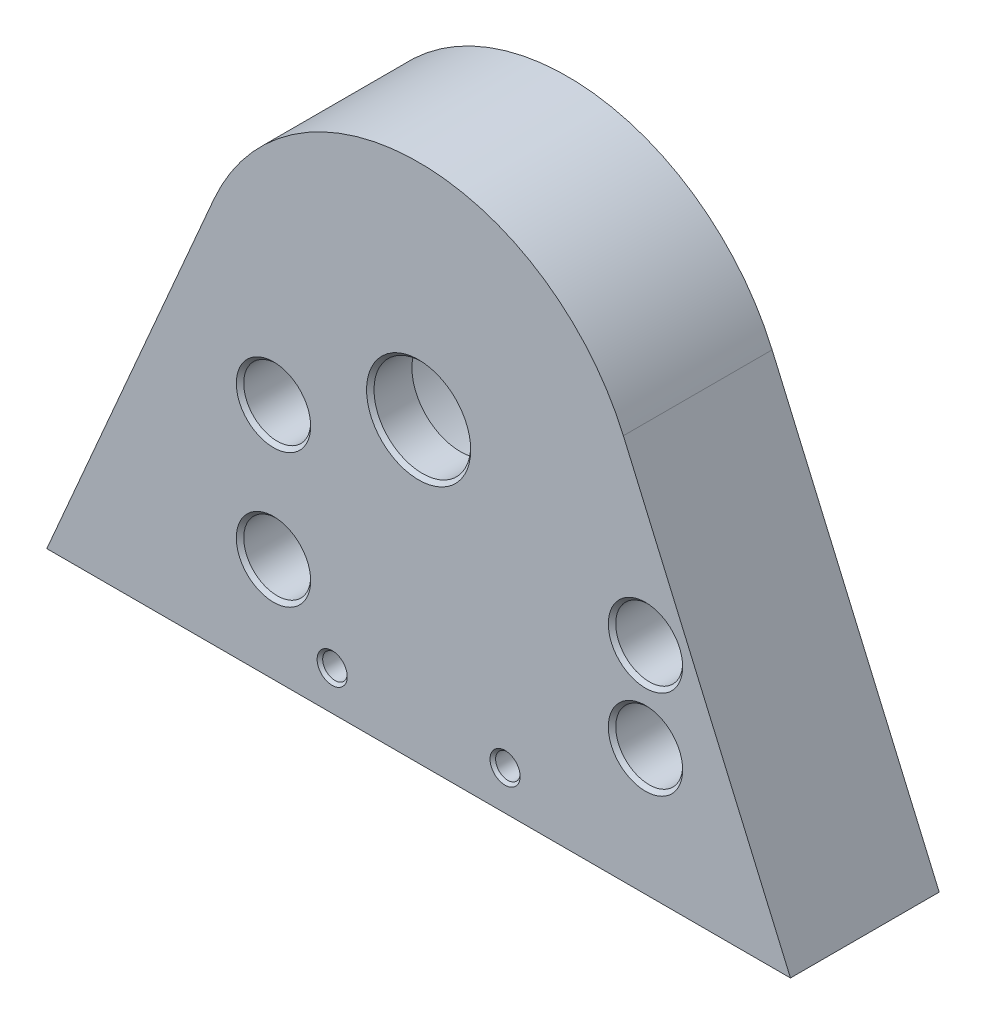
ISO-10303-21;
HEADER;
FILE_DESCRIPTION(('STEP AP214'),'2;1');
FILE_NAME('part.step','',(''),(''),'','','');
FILE_SCHEMA(('AUTOMOTIVE_DESIGN { 1 0 10303 214 1 1 1 1 }'));
ENDSEC;
DATA;
#1=APPLICATION_CONTEXT('core data for automotive mechanical design processes');
#2=APPLICATION_PROTOCOL_DEFINITION('international standard','automotive_design',2000,#1);
#3=PRODUCT_CONTEXT('',#1,'mechanical');
#4=PRODUCT('Part','Part','',(#3));
#5=PRODUCT_RELATED_PRODUCT_CATEGORY('part','',(#4));
#6=PRODUCT_DEFINITION_FORMATION('','',#4);
#7=PRODUCT_DEFINITION_CONTEXT('part definition',#1,'design');
#8=PRODUCT_DEFINITION('design','',#6,#7);
#9=PRODUCT_DEFINITION_SHAPE('','',#8);
#10=(LENGTH_UNIT() NAMED_UNIT(*) SI_UNIT(.MILLI.,.METRE.));
#11=(NAMED_UNIT(*) PLANE_ANGLE_UNIT() SI_UNIT($,.RADIAN.));
#12=(NAMED_UNIT(*) SI_UNIT($,.STERADIAN.) SOLID_ANGLE_UNIT());
#13=UNCERTAINTY_MEASURE_WITH_UNIT(LENGTH_MEASURE(1.E-05),#10,'distance_accuracy_value','');
#14=(GEOMETRIC_REPRESENTATION_CONTEXT(3) GLOBAL_UNCERTAINTY_ASSIGNED_CONTEXT((#13)) GLOBAL_UNIT_ASSIGNED_CONTEXT((#10,
#11,#12)) REPRESENTATION_CONTEXT('',''));
#15=CARTESIAN_POINT('',(0.,0.,0.));
#16=DIRECTION('',(0.,0.,1.));
#17=DIRECTION('',(1.,0.,0.));
#18=AXIS2_PLACEMENT_3D('',#15,#16,#17);
#19=CARTESIAN_POINT('',(80.5040410603039,17.,30.));
#20=DIRECTION('',(0.,0.,-1.));
#21=DIRECTION('',(-1.,0.,0.));
#22=AXIS2_PLACEMENT_3D('',#19,#20,#21);
#23=CYLINDRICAL_SURFACE('',#22,2.25);
#24=CARTESIAN_POINT('',(80.5040410603039,17.,0.));
#25=DIRECTION('',(0.,0.,-1.));
#26=DIRECTION('',(-1.,0.,0.));
#27=AXIS2_PLACEMENT_3D('',#24,#25,#26);
#28=CIRCLE('',#27,2.25);
#29=CARTESIAN_POINT('',(78.2540410603039,17.,0.));
#30=VERTEX_POINT('',#29);
#31=EDGE_CURVE('E213',#30,#30,#28,.T.);
#32=ORIENTED_EDGE('',*,*,#31,.T.);
#33=EDGE_LOOP('',(#32));
#34=FACE_BOUND('',#33,.T.);
#35=CARTESIAN_POINT('',(80.5040410603039,17.,10.));
#36=DIRECTION('',(0.,0.,1.));
#37=DIRECTION('',(1.,0.,0.));
#38=AXIS2_PLACEMENT_3D('',#35,#36,#37);
#39=CIRCLE('',#38,2.25);
#40=CARTESIAN_POINT('',(82.7540410603039,17.,10.));
#41=VERTEX_POINT('',#40);
#42=EDGE_CURVE('E209',#41,#41,#39,.F.);
#43=ORIENTED_EDGE('',*,*,#42,.F.);
#44=EDGE_LOOP('',(#43));
#45=FACE_BOUND('',#44,.T.);
#46=ADVANCED_FACE('F38',(#34,#45),#23,.F.);
#47=CARTESIAN_POINT('',(80.5040410603039,29.,30.));
#48=DIRECTION('',(0.,0.,-1.));
#49=DIRECTION('',(-1.,0.,0.));
#50=AXIS2_PLACEMENT_3D('',#47,#48,#49);
#51=CYLINDRICAL_SURFACE('',#50,2.25);
#52=CARTESIAN_POINT('',(80.5040410603039,29.,0.));
#53=DIRECTION('',(0.,0.,-1.));
#54=DIRECTION('',(-1.,0.,0.));
#55=AXIS2_PLACEMENT_3D('',#52,#53,#54);
#56=CIRCLE('',#55,2.25);
#57=CARTESIAN_POINT('',(78.2540410603039,29.,0.));
#58=VERTEX_POINT('',#57);
#59=EDGE_CURVE('E242',#58,#58,#56,.T.);
#60=ORIENTED_EDGE('',*,*,#59,.T.);
#61=EDGE_LOOP('',(#60));
#62=FACE_BOUND('',#61,.T.);
#63=CARTESIAN_POINT('',(80.5040410603039,29.,10.));
#64=DIRECTION('',(0.,0.,1.));
#65=DIRECTION('',(1.,0.,0.));
#66=AXIS2_PLACEMENT_3D('',#63,#64,#65);
#67=CIRCLE('',#66,2.25);
#68=CARTESIAN_POINT('',(82.7540410603039,29.,10.));
#69=VERTEX_POINT('',#68);
#70=EDGE_CURVE('E206',#69,#69,#67,.F.);
#71=ORIENTED_EDGE('',*,*,#70,.F.);
#72=EDGE_LOOP('',(#71));
#73=FACE_BOUND('',#72,.T.);
#74=ADVANCED_FACE('F304',(#62,#73),#51,.F.);
#75=CARTESIAN_POINT('',(50.,40.,0.));
#76=DIRECTION('',(0.,0.,1.));
#77=DIRECTION('',(1.,0.,0.));
#78=AXIS2_PLACEMENT_3D('',#75,#76,#77);
#79=PLANE('',#78);
#80=ORIENTED_EDGE('',*,*,#59,.F.);
#81=EDGE_LOOP('',(#80));
#82=FACE_BOUND('',#81,.T.);
#83=ORIENTED_EDGE('',*,*,#31,.F.);
#84=EDGE_LOOP('',(#83));
#85=FACE_BOUND('',#84,.T.);
#86=CARTESIAN_POINT('',(49.9999999999999,60.,0.));
#87=DIRECTION('',(0.,0.,-1.));
#88=DIRECTION('',(-1.,0.,0.));
#89=AXIS2_PLACEMENT_3D('',#86,#87,#88);
#90=CIRCLE('',#89,2.025);
#91=CARTESIAN_POINT('',(47.9749999999999,60.,0.));
#92=VERTEX_POINT('',#91);
#93=EDGE_CURVE('E204',#92,#92,#90,.T.);
#94=ORIENTED_EDGE('',*,*,#93,.F.);
#95=EDGE_LOOP('',(#94));
#96=FACE_BOUND('',#95,.T.);
#97=DIRECTION('',(-0.397177347499071,-0.917741877999257,0.));
#98=VECTOR('',#97,1.);
#99=CARTESIAN_POINT('',(22.4677436600223,51.9153204249721,0.));
#100=LINE('',#99,#98);
#101=CARTESIAN_POINT('',(22.4677436600223,51.9153204249721,0.));
#102=VERTEX_POINT('',#101);
#103=CARTESIAN_POINT('',(0.,0.,0.));
#104=VERTEX_POINT('',#103);
#105=EDGE_CURVE('E131',#102,#104,#100,.T.);
#106=ORIENTED_EDGE('',*,*,#105,.F.);
#107=CARTESIAN_POINT('',(50.,40.,0.));
#108=DIRECTION('',(0.,0.,1.));
#109=DIRECTION('',(1.,0.,0.));
#110=AXIS2_PLACEMENT_3D('',#107,#108,#109);
#111=CIRCLE('',#110,30.);
#112=CARTESIAN_POINT('',(77.5322563399777,51.9153204249721,0.));
#113=VERTEX_POINT('',#112);
#114=EDGE_CURVE('E79',#113,#102,#111,.T.);
#115=ORIENTED_EDGE('',*,*,#114,.F.);
#116=DIRECTION('',(-0.397177347499071,0.917741877999257,0.));
#117=VECTOR('',#116,1.);
#118=CARTESIAN_POINT('',(77.5322563399777,51.9153204249721,0.));
#119=LINE('',#118,#117);
#120=CARTESIAN_POINT('',(100.,0.,0.));
#121=VERTEX_POINT('',#120);
#122=EDGE_CURVE('E73',#121,#113,#119,.T.);
#123=ORIENTED_EDGE('',*,*,#122,.F.);
#124=DIRECTION('',(1.,0.,0.));
#125=VECTOR('',#124,1.);
#126=CARTESIAN_POINT('',(0.,0.,0.));
#127=LINE('',#126,#125);
#128=EDGE_CURVE('E134',#104,#121,#127,.T.);
#129=ORIENTED_EDGE('',*,*,#128,.F.);
#130=EDGE_LOOP('',(#106,#115,#123,#129));
#131=FACE_BOUND('',#130,.T.);
#132=CARTESIAN_POINT('',(50.,40.,0.));
#133=DIRECTION('',(0.,0.,1.));
#134=DIRECTION('',(1.,0.,0.));
#135=AXIS2_PLACEMENT_3D('',#132,#133,#134);
#136=CIRCLE('',#135,15.5);
#137=CARTESIAN_POINT('',(65.5,40.,0.));
#138=VERTEX_POINT('',#137);
#139=EDGE_CURVE('E175',#138,#138,#136,.T.);
#140=ORIENTED_EDGE('',*,*,#139,.T.);
#141=EDGE_LOOP('',(#140));
#142=FACE_BOUND('',#141,.T.);
#143=CARTESIAN_POINT('',(30.482023170171,32.,0.));
#144=DIRECTION('',(0.,0.,1.));
#145=DIRECTION('',(1.,0.,0.));
#146=AXIS2_PLACEMENT_3D('',#143,#144,#145);
#147=CIRCLE('',#146,2.75000000000002);
#148=CARTESIAN_POINT('',(33.232023170171,32.,0.));
#149=VERTEX_POINT('',#148);
#150=EDGE_CURVE('E178',#149,#149,#147,.T.);
#151=ORIENTED_EDGE('',*,*,#150,.T.);
#152=EDGE_LOOP('',(#151));
#153=FACE_BOUND('',#152,.T.);
#154=CARTESIAN_POINT('',(30.482023170171,14.,0.));
#155=DIRECTION('',(0.,0.,1.));
#156=DIRECTION('',(1.,0.,0.));
#157=AXIS2_PLACEMENT_3D('',#154,#155,#156);
#158=CIRCLE('',#157,2.75000000000002);
#159=CARTESIAN_POINT('',(33.232023170171,14.,0.));
#160=VERTEX_POINT('',#159);
#161=EDGE_CURVE('E181',#160,#160,#158,.T.);
#162=ORIENTED_EDGE('',*,*,#161,.T.);
#163=EDGE_LOOP('',(#162));
#164=FACE_BOUND('',#163,.T.);
#165=CARTESIAN_POINT('',(50.0000000000001,20.,0.));
#166=DIRECTION('',(0.,0.,-1.));
#167=DIRECTION('',(-1.,0.,0.));
#168=AXIS2_PLACEMENT_3D('',#165,#166,#167);
#169=CIRCLE('',#168,2.025);
#170=CARTESIAN_POINT('',(47.9750000000001,20.,0.));
#171=VERTEX_POINT('',#170);
#172=EDGE_CURVE('E199',#171,#171,#169,.T.);
#173=ORIENTED_EDGE('',*,*,#172,.F.);
#174=EDGE_LOOP('',(#173));
#175=FACE_BOUND('',#174,.T.);
#176=CARTESIAN_POINT('',(70.,40.0000000000001,0.));
#177=DIRECTION('',(0.,0.,-1.));
#178=DIRECTION('',(-1.,0.,0.));
#179=AXIS2_PLACEMENT_3D('',#176,#177,#178);
#180=CIRCLE('',#179,2.025);
#181=CARTESIAN_POINT('',(67.975,40.0000000000001,0.));
#182=VERTEX_POINT('',#181);
#183=EDGE_CURVE('E245',#182,#182,#180,.T.);
#184=ORIENTED_EDGE('',*,*,#183,.F.);
#185=EDGE_LOOP('',(#184));
#186=FACE_BOUND('',#185,.T.);
#187=ADVANCED_FACE('F300',(#82,#85,#96,#131,#142,#153,#164,#175,#186),#79,.F.);
#188=CARTESIAN_POINT('',(30.482023170171,14.,20.));
#189=DIRECTION('',(0.,0.,-1.));
#190=DIRECTION('',(-1.,0.,0.));
#191=AXIS2_PLACEMENT_3D('',#188,#189,#190);
#192=CYLINDRICAL_SURFACE('',#191,2.25);
#193=CARTESIAN_POINT('',(30.482023170171,14.,0.500000000000011));
#194=DIRECTION('',(0.,0.,1.));
#195=DIRECTION('',(1.,0.,0.));
#196=AXIS2_PLACEMENT_3D('',#193,#194,#195);
#197=CIRCLE('',#196,2.25);
#198=CARTESIAN_POINT('',(32.732023170171,14.,0.500000000000011));
#199=VERTEX_POINT('',#198);
#200=EDGE_CURVE('E172',#199,#199,#197,.F.);
#201=ORIENTED_EDGE('',*,*,#200,.T.);
#202=EDGE_LOOP('',(#201));
#203=FACE_BOUND('',#202,.T.);
#204=CARTESIAN_POINT('',(30.482023170171,14.,10.));
#205=DIRECTION('',(0.,0.,1.));
#206=DIRECTION('',(1.,0.,0.));
#207=AXIS2_PLACEMENT_3D('',#204,#205,#206);
#208=CIRCLE('',#207,2.25);
#209=CARTESIAN_POINT('',(32.732023170171,14.,10.));
#210=VERTEX_POINT('',#209);
#211=EDGE_CURVE('E151',#210,#210,#208,.F.);
#212=ORIENTED_EDGE('',*,*,#211,.F.);
#213=EDGE_LOOP('',(#212));
#214=FACE_BOUND('',#213,.T.);
#215=ADVANCED_FACE('F303',(#203,#214),#192,.F.);
#216=CARTESIAN_POINT('',(30.482023170171,32.,20.));
#217=DIRECTION('',(0.,0.,-1.));
#218=DIRECTION('',(-1.,0.,0.));
#219=AXIS2_PLACEMENT_3D('',#216,#217,#218);
#220=CYLINDRICAL_SURFACE('',#219,2.25);
#221=CARTESIAN_POINT('',(30.482023170171,32.,0.500000000000011));
#222=DIRECTION('',(0.,0.,1.));
#223=DIRECTION('',(1.,0.,0.));
#224=AXIS2_PLACEMENT_3D('',#221,#222,#223);
#225=CIRCLE('',#224,2.25);
#226=CARTESIAN_POINT('',(32.732023170171,32.,0.500000000000011));
#227=VERTEX_POINT('',#226);
#228=EDGE_CURVE('E184',#227,#227,#225,.F.);
#229=ORIENTED_EDGE('',*,*,#228,.T.);
#230=EDGE_LOOP('',(#229));
#231=FACE_BOUND('',#230,.T.);
#232=CARTESIAN_POINT('',(30.482023170171,32.,10.));
#233=DIRECTION('',(0.,0.,1.));
#234=DIRECTION('',(1.,0.,0.));
#235=AXIS2_PLACEMENT_3D('',#232,#233,#234);
#236=CIRCLE('',#235,2.25);
#237=CARTESIAN_POINT('',(32.732023170171,32.,10.));
#238=VERTEX_POINT('',#237);
#239=EDGE_CURVE('E148',#238,#238,#236,.F.);
#240=ORIENTED_EDGE('',*,*,#239,.F.);
#241=EDGE_LOOP('',(#240));
#242=FACE_BOUND('',#241,.T.);
#243=ADVANCED_FACE('F395',(#231,#242),#220,.F.);
#244=CARTESIAN_POINT('',(50.,40.,20.));
#245=DIRECTION('',(0.,0.,-1.));
#246=DIRECTION('',(-1.,0.,0.));
#247=AXIS2_PLACEMENT_3D('',#244,#245,#246);
#248=CYLINDRICAL_SURFACE('',#247,6.5);
#249=CARTESIAN_POINT('',(50.,40.,19.4999999999999));
#250=DIRECTION('',(0.,0.,1.));
#251=DIRECTION('',(1.,0.,0.));
#252=AXIS2_PLACEMENT_3D('',#249,#250,#251);
#253=CIRCLE('',#252,6.5);
#254=CARTESIAN_POINT('',(56.5,40.,19.4999999999999));
#255=VERTEX_POINT('',#254);
#256=EDGE_CURVE('E166',#255,#255,#253,.T.);
#257=ORIENTED_EDGE('',*,*,#256,.T.);
#258=EDGE_LOOP('',(#257));
#259=FACE_BOUND('',#258,.T.);
#260=CARTESIAN_POINT('',(50.,40.,14.4));
#261=DIRECTION('',(0.,0.,-1.));
#262=DIRECTION('',(-1.,0.,0.));
#263=AXIS2_PLACEMENT_3D('',#260,#261,#262);
#264=CIRCLE('',#263,6.5);
#265=CARTESIAN_POINT('',(43.5,40.,14.4));
#266=VERTEX_POINT('',#265);
#267=EDGE_CURVE('E123',#266,#266,#264,.T.);
#268=ORIENTED_EDGE('',*,*,#267,.T.);
#269=EDGE_LOOP('',(#268));
#270=FACE_BOUND('',#269,.T.);
#271=ADVANCED_FACE('F289',(#259,#270),#248,.F.);
#272=CARTESIAN_POINT('',(50.,40.,20.));
#273=DIRECTION('',(0.,0.,1.));
#274=DIRECTION('',(1.,0.,0.));
#275=AXIS2_PLACEMENT_3D('',#272,#273,#274);
#276=PLANE('',#275);
#277=CARTESIAN_POINT('',(80.5040410603039,17.,20.));
#278=DIRECTION('',(0.,0.,1.));
#279=DIRECTION('',(1.,0.,0.));
#280=AXIS2_PLACEMENT_3D('',#277,#278,#279);
#281=CIRCLE('',#280,5.00000000000005);
#282=CARTESIAN_POINT('',(85.5040410603039,17.,20.));
#283=VERTEX_POINT('',#282);
#284=EDGE_CURVE('E47',#283,#283,#281,.F.);
#285=ORIENTED_EDGE('',*,*,#284,.T.);
#286=EDGE_LOOP('',(#285));
#287=FACE_BOUND('',#286,.T.);
#288=CARTESIAN_POINT('',(80.5040410603039,29.,20.));
#289=DIRECTION('',(0.,0.,1.));
#290=DIRECTION('',(1.,0.,0.));
#291=AXIS2_PLACEMENT_3D('',#288,#289,#290);
#292=CIRCLE('',#291,5.00000000000005);
#293=CARTESIAN_POINT('',(85.5040410603039,29.,20.));
#294=VERTEX_POINT('',#293);
#295=EDGE_CURVE('E216',#294,#294,#292,.F.);
#296=ORIENTED_EDGE('',*,*,#295,.T.);
#297=EDGE_LOOP('',(#296));
#298=FACE_BOUND('',#297,.T.);
#299=CARTESIAN_POINT('',(30.482023170171,14.,20.));
#300=DIRECTION('',(0.,0.,1.));
#301=DIRECTION('',(1.,0.,0.));
#302=AXIS2_PLACEMENT_3D('',#299,#300,#301);
#303=CIRCLE('',#302,5.00000000000005);
#304=CARTESIAN_POINT('',(35.482023170171,14.,20.));
#305=VERTEX_POINT('',#304);
#306=EDGE_CURVE('E163',#305,#305,#303,.F.);
#307=ORIENTED_EDGE('',*,*,#306,.T.);
#308=EDGE_LOOP('',(#307));
#309=FACE_BOUND('',#308,.T.);
#310=CARTESIAN_POINT('',(50.,40.,20.));
#311=DIRECTION('',(0.,0.,1.));
#312=DIRECTION('',(1.,0.,0.));
#313=AXIS2_PLACEMENT_3D('',#310,#311,#312);
#314=CIRCLE('',#313,7.00000000000006);
#315=CARTESIAN_POINT('',(57.0000000000001,40.,20.));
#316=VERTEX_POINT('',#315);
#317=EDGE_CURVE('E160',#316,#316,#314,.F.);
#318=ORIENTED_EDGE('',*,*,#317,.T.);
#319=EDGE_LOOP('',(#318));
#320=FACE_BOUND('',#319,.T.);
#321=CARTESIAN_POINT('',(30.482023170171,32.,20.));
#322=DIRECTION('',(0.,0.,1.));
#323=DIRECTION('',(1.,0.,0.));
#324=AXIS2_PLACEMENT_3D('',#321,#322,#323);
#325=CIRCLE('',#324,5.00000000000005);
#326=CARTESIAN_POINT('',(35.482023170171,32.,20.));
#327=VERTEX_POINT('',#326);
#328=EDGE_CURVE('E157',#327,#327,#325,.F.);
#329=ORIENTED_EDGE('',*,*,#328,.T.);
#330=EDGE_LOOP('',(#329));
#331=FACE_BOUND('',#330,.T.);
#332=CARTESIAN_POINT('',(38.375,5.29,20.));
#333=DIRECTION('',(0.,0.,1.));
#334=DIRECTION('',(1.,0.,0.));
#335=AXIS2_PLACEMENT_3D('',#332,#333,#334);
#336=CIRCLE('',#335,2.025);
#337=CARTESIAN_POINT('',(40.4,5.29,20.));
#338=VERTEX_POINT('',#337);
#339=EDGE_CURVE('E111',#338,#338,#336,.T.);
#340=ORIENTED_EDGE('',*,*,#339,.F.);
#341=EDGE_LOOP('',(#340));
#342=FACE_BOUND('',#341,.T.);
#343=CARTESIAN_POINT('',(61.625,5.29,20.));
#344=DIRECTION('',(0.,0.,1.));
#345=DIRECTION('',(1.,0.,0.));
#346=AXIS2_PLACEMENT_3D('',#343,#344,#345);
#347=CIRCLE('',#346,2.025);
#348=CARTESIAN_POINT('',(63.65,5.29,20.));
#349=VERTEX_POINT('',#348);
#350=EDGE_CURVE('E104',#349,#349,#347,.T.);
#351=ORIENTED_EDGE('',*,*,#350,.F.);
#352=EDGE_LOOP('',(#351));
#353=FACE_BOUND('',#352,.T.);
#354=DIRECTION('',(-0.397177347499071,-0.917741877999257,0.));
#355=VECTOR('',#354,1.);
#356=CARTESIAN_POINT('',(22.4677436600223,51.9153204249721,20.));
#357=LINE('',#356,#355);
#358=CARTESIAN_POINT('',(22.4677436600223,51.9153204249721,20.));
#359=VERTEX_POINT('',#358);
#360=CARTESIAN_POINT('',(0.,0.,20.));
#361=VERTEX_POINT('',#360);
#362=EDGE_CURVE('E124',#359,#361,#357,.T.);
#363=ORIENTED_EDGE('',*,*,#362,.T.);
#364=DIRECTION('',(1.,0.,0.));
#365=VECTOR('',#364,1.);
#366=CARTESIAN_POINT('',(0.,0.,20.));
#367=LINE('',#366,#365);
#368=CARTESIAN_POINT('',(100.,0.,20.));
#369=VERTEX_POINT('',#368);
#370=EDGE_CURVE('E87',#361,#369,#367,.T.);
#371=ORIENTED_EDGE('',*,*,#370,.T.);
#372=DIRECTION('',(-0.397177347499071,0.917741877999257,0.));
#373=VECTOR('',#372,1.);
#374=CARTESIAN_POINT('',(77.5322563399777,51.9153204249721,20.));
#375=LINE('',#374,#373);
#376=CARTESIAN_POINT('',(77.5322563399777,51.9153204249721,20.));
#377=VERTEX_POINT('',#376);
#378=EDGE_CURVE('E127',#369,#377,#375,.T.);
#379=ORIENTED_EDGE('',*,*,#378,.T.);
#380=CARTESIAN_POINT('',(50.,40.,20.));
#381=DIRECTION('',(0.,0.,1.));
#382=DIRECTION('',(1.,0.,0.));
#383=AXIS2_PLACEMENT_3D('',#380,#381,#382);
#384=CIRCLE('',#383,30.);
#385=EDGE_CURVE('E55',#377,#359,#384,.T.);
#386=ORIENTED_EDGE('',*,*,#385,.T.);
#387=EDGE_LOOP('',(#363,#371,#379,#386));
#388=FACE_BOUND('',#387,.T.);
#389=ADVANCED_FACE('F221',(#287,#298,#309,#320,#331,#342,#353,#388),#276,.T.);
#390=CARTESIAN_POINT('',(22.4677436600223,51.9153204249721,20.));
#391=DIRECTION('',(0.917741877999257,-0.397177347499071,0.));
#392=DIRECTION('',(0.397177347499071,0.917741877999257,0.));
#393=AXIS2_PLACEMENT_3D('',#390,#391,#392);
#394=PLANE('',#393);
#395=ORIENTED_EDGE('',*,*,#105,.T.);
#396=DIRECTION('',(0.,0.,-1.));
#397=VECTOR('',#396,1.);
#398=CARTESIAN_POINT('',(0.,0.,20.));
#399=LINE('',#398,#397);
#400=EDGE_CURVE('E143',#361,#104,#399,.T.);
#401=ORIENTED_EDGE('',*,*,#400,.F.);
#402=ORIENTED_EDGE('',*,*,#362,.F.);
#403=DIRECTION('',(0.,0.,-1.));
#404=VECTOR('',#403,1.);
#405=CARTESIAN_POINT('',(22.4677436600223,51.9153204249721,20.));
#406=LINE('',#405,#404);
#407=EDGE_CURVE('E130',#359,#102,#406,.T.);
#408=ORIENTED_EDGE('',*,*,#407,.T.);
#409=EDGE_LOOP('',(#395,#401,#402,#408));
#410=FACE_BOUND('',#409,.T.);
#411=ADVANCED_FACE('F288',(#410),#394,.F.);
#412=CARTESIAN_POINT('',(0.,0.,20.));
#413=DIRECTION('',(0.,1.,0.));
#414=DIRECTION('',(0.,0.,1.));
#415=AXIS2_PLACEMENT_3D('',#412,#413,#414);
#416=PLANE('',#415);
#417=ORIENTED_EDGE('',*,*,#128,.T.);
#418=DIRECTION('',(0.,0.,-1.));
#419=VECTOR('',#418,1.);
#420=CARTESIAN_POINT('',(100.,0.,20.));
#421=LINE('',#420,#419);
#422=EDGE_CURVE('E141',#369,#121,#421,.T.);
#423=ORIENTED_EDGE('',*,*,#422,.F.);
#424=ORIENTED_EDGE('',*,*,#370,.F.);
#425=ORIENTED_EDGE('',*,*,#400,.T.);
#426=EDGE_LOOP('',(#417,#423,#424,#425));
#427=FACE_BOUND('',#426,.T.);
#428=ADVANCED_FACE('F296',(#427),#416,.F.);
#429=CARTESIAN_POINT('',(77.5322563399777,51.9153204249721,20.));
#430=DIRECTION('',(-0.917741877999257,-0.397177347499071,0.));
#431=DIRECTION('',(0.397177347499071,-0.917741877999257,0.));
#432=AXIS2_PLACEMENT_3D('',#429,#430,#431);
#433=PLANE('',#432);
#434=ORIENTED_EDGE('',*,*,#122,.T.);
#435=DIRECTION('',(0.,0.,-1.));
#436=VECTOR('',#435,1.);
#437=CARTESIAN_POINT('',(77.5322563399777,51.9153204249721,20.));
#438=LINE('',#437,#436);
#439=EDGE_CURVE('E139',#377,#113,#438,.T.);
#440=ORIENTED_EDGE('',*,*,#439,.F.);
#441=ORIENTED_EDGE('',*,*,#378,.F.);
#442=ORIENTED_EDGE('',*,*,#422,.T.);
#443=EDGE_LOOP('',(#434,#440,#441,#442));
#444=FACE_BOUND('',#443,.T.);
#445=ADVANCED_FACE('F299',(#444),#433,.F.);
#446=CARTESIAN_POINT('',(50.,40.,20.));
#447=DIRECTION('',(0.,0.,-1.));
#448=DIRECTION('',(-1.,0.,0.));
#449=AXIS2_PLACEMENT_3D('',#446,#447,#448);
#450=CYLINDRICAL_SURFACE('',#449,30.);
#451=ORIENTED_EDGE('',*,*,#114,.T.);
#452=ORIENTED_EDGE('',*,*,#407,.F.);
#453=ORIENTED_EDGE('',*,*,#385,.F.);
#454=ORIENTED_EDGE('',*,*,#439,.T.);
#455=EDGE_LOOP('',(#451,#452,#453,#454));
#456=FACE_BOUND('',#455,.T.);
#457=ADVANCED_FACE('F425',(#456),#450,.T.);
#458=CARTESIAN_POINT('',(50.,40.,14.4));
#459=DIRECTION('',(0.,0.,-1.));
#460=DIRECTION('',(-1.,0.,0.));
#461=AXIS2_PLACEMENT_3D('',#458,#459,#460);
#462=CYLINDRICAL_SURFACE('',#461,15.);
#463=CARTESIAN_POINT('',(50.,40.,0.5));
#464=DIRECTION('',(0.,0.,1.));
#465=DIRECTION('',(1.,0.,0.));
#466=AXIS2_PLACEMENT_3D('',#463,#464,#465);
#467=CIRCLE('',#466,15.);
#468=CARTESIAN_POINT('',(65.,40.,0.5));
#469=VERTEX_POINT('',#468);
#470=EDGE_CURVE('E187',#469,#469,#467,.F.);
#471=ORIENTED_EDGE('',*,*,#470,.T.);
#472=EDGE_LOOP('',(#471));
#473=FACE_BOUND('',#472,.T.);
#474=CARTESIAN_POINT('',(50.,40.,14.4));
#475=DIRECTION('',(0.,0.,-1.));
#476=DIRECTION('',(-1.,0.,0.));
#477=AXIS2_PLACEMENT_3D('',#474,#475,#476);
#478=CIRCLE('',#477,15.);
#479=CARTESIAN_POINT('',(35.,40.,14.4));
#480=VERTEX_POINT('',#479);
#481=EDGE_CURVE('E120',#480,#480,#478,.T.);
#482=ORIENTED_EDGE('',*,*,#481,.F.);
#483=EDGE_LOOP('',(#482));
#484=FACE_BOUND('',#483,.T.);
#485=ADVANCED_FACE('F421',(#473,#484),#462,.F.);
#486=CARTESIAN_POINT('',(50.,40.,14.4));
#487=DIRECTION('',(0.,0.,-1.));
#488=DIRECTION('',(-1.,0.,0.));
#489=AXIS2_PLACEMENT_3D('',#486,#487,#488);
#490=PLANE('',#489);
#491=ORIENTED_EDGE('',*,*,#267,.F.);
#492=EDGE_LOOP('',(#491));
#493=FACE_BOUND('',#492,.T.);
#494=ORIENTED_EDGE('',*,*,#481,.T.);
#495=EDGE_LOOP('',(#494));
#496=FACE_BOUND('',#495,.T.);
#497=ADVANCED_FACE('F417',(#493,#496),#490,.T.);
#498=CARTESIAN_POINT('',(61.625,5.29,8.5));
#499=DIRECTION('',(0.,0.,1.));
#500=DIRECTION('',(1.,0.,0.));
#501=AXIS2_PLACEMENT_3D('',#498,#499,#500);
#502=CONICAL_SURFACE('',#501,1.65,1.02974425867665);
#503=CARTESIAN_POINT('',(61.625,5.29,7.50857997860453));
#504=VERTEX_POINT('',#503);
#505=VERTEX_LOOP('',#504);
#506=FACE_BOUND('',#505,.T.);
#507=CARTESIAN_POINT('',(61.625,5.29,8.5));
#508=DIRECTION('',(0.,0.,1.));
#509=DIRECTION('',(1.,0.,0.));
#510=AXIS2_PLACEMENT_3D('',#507,#508,#509);
#511=CIRCLE('',#510,1.65);
#512=CARTESIAN_POINT('',(63.275,5.29,8.5));
#513=VERTEX_POINT('',#512);
#514=EDGE_CURVE('E117',#513,#513,#511,.T.);
#515=ORIENTED_EDGE('',*,*,#514,.T.);
#516=EDGE_LOOP('',(#515));
#517=FACE_BOUND('',#516,.T.);
#518=ADVANCED_FACE('F413',(#506,#517),#502,.F.);
#519=CARTESIAN_POINT('',(61.625,5.29,20.));
#520=DIRECTION('',(0.,0.,1.));
#521=DIRECTION('',(1.,0.,0.));
#522=AXIS2_PLACEMENT_3D('',#519,#520,#521);
#523=CYLINDRICAL_SURFACE('',#522,1.65);
#524=ORIENTED_EDGE('',*,*,#514,.F.);
#525=EDGE_LOOP('',(#524));
#526=FACE_BOUND('',#525,.T.);
#527=CARTESIAN_POINT('',(61.625,5.29,19.625));
#528=DIRECTION('',(0.,0.,1.));
#529=DIRECTION('',(1.,0.,0.));
#530=AXIS2_PLACEMENT_3D('',#527,#528,#529);
#531=CIRCLE('',#530,1.65);
#532=CARTESIAN_POINT('',(63.275,5.29,19.625));
#533=VERTEX_POINT('',#532);
#534=EDGE_CURVE('E108',#533,#533,#531,.T.);
#535=ORIENTED_EDGE('',*,*,#534,.T.);
#536=EDGE_LOOP('',(#535));
#537=FACE_BOUND('',#536,.T.);
#538=ADVANCED_FACE('F409',(#526,#537),#523,.F.);
#539=CARTESIAN_POINT('',(61.625,5.29,20.));
#540=DIRECTION('',(0.,0.,1.));
#541=DIRECTION('',(1.,0.,0.));
#542=AXIS2_PLACEMENT_3D('',#539,#540,#541);
#543=CONICAL_SURFACE('',#542,2.025,0.785398163397444);
#544=ORIENTED_EDGE('',*,*,#534,.F.);
#545=EDGE_LOOP('',(#544));
#546=FACE_BOUND('',#545,.T.);
#547=ORIENTED_EDGE('',*,*,#350,.T.);
#548=EDGE_LOOP('',(#547));
#549=FACE_BOUND('',#548,.T.);
#550=ADVANCED_FACE('F98',(#546,#549),#543,.F.);
#551=CARTESIAN_POINT('',(38.375,5.29,8.5));
#552=DIRECTION('',(0.,0.,1.));
#553=DIRECTION('',(1.,0.,0.));
#554=AXIS2_PLACEMENT_3D('',#551,#552,#553);
#555=CONICAL_SURFACE('',#554,1.65,1.02974425867665);
#556=CARTESIAN_POINT('',(38.375,5.29,7.50857997860453));
#557=VERTEX_POINT('',#556);
#558=VERTEX_LOOP('',#557);
#559=FACE_BOUND('',#558,.T.);
#560=CARTESIAN_POINT('',(38.375,5.29,8.5));
#561=DIRECTION('',(0.,0.,1.));
#562=DIRECTION('',(1.,0.,0.));
#563=AXIS2_PLACEMENT_3D('',#560,#561,#562);
#564=CIRCLE('',#563,1.65);
#565=CARTESIAN_POINT('',(40.025,5.29,8.5));
#566=VERTEX_POINT('',#565);
#567=EDGE_CURVE('E102',#566,#566,#564,.T.);
#568=ORIENTED_EDGE('',*,*,#567,.T.);
#569=EDGE_LOOP('',(#568));
#570=FACE_BOUND('',#569,.T.);
#571=ADVANCED_FACE('F94',(#559,#570),#555,.F.);
#572=CARTESIAN_POINT('',(38.375,5.29,20.));
#573=DIRECTION('',(0.,0.,1.));
#574=DIRECTION('',(1.,0.,0.));
#575=AXIS2_PLACEMENT_3D('',#572,#573,#574);
#576=CYLINDRICAL_SURFACE('',#575,1.65);
#577=ORIENTED_EDGE('',*,*,#567,.F.);
#578=EDGE_LOOP('',(#577));
#579=FACE_BOUND('',#578,.T.);
#580=CARTESIAN_POINT('',(38.375,5.29,19.625));
#581=DIRECTION('',(0.,0.,1.));
#582=DIRECTION('',(1.,0.,0.));
#583=AXIS2_PLACEMENT_3D('',#580,#581,#582);
#584=CIRCLE('',#583,1.65);
#585=CARTESIAN_POINT('',(40.025,5.29,19.625));
#586=VERTEX_POINT('',#585);
#587=EDGE_CURVE('E105',#586,#586,#584,.T.);
#588=ORIENTED_EDGE('',*,*,#587,.T.);
#589=EDGE_LOOP('',(#588));
#590=FACE_BOUND('',#589,.T.);
#591=ADVANCED_FACE('F97',(#579,#590),#576,.F.);
#592=CARTESIAN_POINT('',(38.375,5.29,20.));
#593=DIRECTION('',(0.,0.,1.));
#594=DIRECTION('',(1.,0.,0.));
#595=AXIS2_PLACEMENT_3D('',#592,#593,#594);
#596=CONICAL_SURFACE('',#595,2.025,0.785398163397444);
#597=ORIENTED_EDGE('',*,*,#587,.F.);
#598=EDGE_LOOP('',(#597));
#599=FACE_BOUND('',#598,.T.);
#600=ORIENTED_EDGE('',*,*,#339,.T.);
#601=EDGE_LOOP('',(#600));
#602=FACE_BOUND('',#601,.T.);
#603=ADVANCED_FACE('F284',(#599,#602),#596,.F.);
#604=CARTESIAN_POINT('',(30.482023170171,32.,10.));
#605=DIRECTION('',(0.,0.,1.));
#606=DIRECTION('',(1.,0.,0.));
#607=AXIS2_PLACEMENT_3D('',#604,#605,#606);
#608=PLANE('',#607);
#609=CARTESIAN_POINT('',(30.482023170171,32.,10.));
#610=DIRECTION('',(0.,0.,1.));
#611=DIRECTION('',(1.,0.,0.));
#612=AXIS2_PLACEMENT_3D('',#609,#610,#611);
#613=CIRCLE('',#612,4.5);
#614=CARTESIAN_POINT('',(34.982023170171,32.,10.));
#615=VERTEX_POINT('',#614);
#616=EDGE_CURVE('E152',#615,#615,#613,.T.);
#617=ORIENTED_EDGE('',*,*,#616,.T.);
#618=EDGE_LOOP('',(#617));
#619=FACE_BOUND('',#618,.T.);
#620=ORIENTED_EDGE('',*,*,#239,.T.);
#621=EDGE_LOOP('',(#620));
#622=FACE_BOUND('',#621,.T.);
#623=ADVANCED_FACE('F378',(#619,#622),#608,.T.);
#624=CARTESIAN_POINT('',(30.482023170171,32.,10.));
#625=DIRECTION('',(0.,0.,1.));
#626=DIRECTION('',(1.,0.,0.));
#627=AXIS2_PLACEMENT_3D('',#624,#625,#626);
#628=CYLINDRICAL_SURFACE('',#627,4.5);
#629=CARTESIAN_POINT('',(30.482023170171,32.,19.5));
#630=DIRECTION('',(0.,0.,1.));
#631=DIRECTION('',(1.,0.,0.));
#632=AXIS2_PLACEMENT_3D('',#629,#630,#631);
#633=CIRCLE('',#632,4.5);
#634=CARTESIAN_POINT('',(34.982023170171,32.,19.5));
#635=VERTEX_POINT('',#634);
#636=EDGE_CURVE('E169',#635,#635,#633,.T.);
#637=ORIENTED_EDGE('',*,*,#636,.T.);
#638=EDGE_LOOP('',(#637));
#639=FACE_BOUND('',#638,.T.);
#640=ORIENTED_EDGE('',*,*,#616,.F.);
#641=EDGE_LOOP('',(#640));
#642=FACE_BOUND('',#641,.T.);
#643=ADVANCED_FACE('F381',(#639,#642),#628,.F.);
#644=CARTESIAN_POINT('',(30.482023170171,14.,10.));
#645=DIRECTION('',(0.,0.,1.));
#646=DIRECTION('',(1.,0.,0.));
#647=AXIS2_PLACEMENT_3D('',#644,#645,#646);
#648=PLANE('',#647);
#649=CARTESIAN_POINT('',(30.482023170171,14.,10.));
#650=DIRECTION('',(0.,0.,1.));
#651=DIRECTION('',(1.,0.,0.));
#652=AXIS2_PLACEMENT_3D('',#649,#650,#651);
#653=CIRCLE('',#652,4.5);
#654=CARTESIAN_POINT('',(34.982023170171,14.,10.));
#655=VERTEX_POINT('',#654);
#656=EDGE_CURVE('E272',#655,#655,#653,.T.);
#657=ORIENTED_EDGE('',*,*,#656,.T.);
#658=EDGE_LOOP('',(#657));
#659=FACE_BOUND('',#658,.T.);
#660=ORIENTED_EDGE('',*,*,#211,.T.);
#661=EDGE_LOOP('',(#660));
#662=FACE_BOUND('',#661,.T.);
#663=ADVANCED_FACE('F385',(#659,#662),#648,.T.);
#664=CARTESIAN_POINT('',(30.482023170171,14.,10.));
#665=DIRECTION('',(0.,0.,1.));
#666=DIRECTION('',(1.,0.,0.));
#667=AXIS2_PLACEMENT_3D('',#664,#665,#666);
#668=CYLINDRICAL_SURFACE('',#667,4.5);
#669=CARTESIAN_POINT('',(30.482023170171,14.,19.5));
#670=DIRECTION('',(0.,0.,1.));
#671=DIRECTION('',(1.,0.,0.));
#672=AXIS2_PLACEMENT_3D('',#669,#670,#671);
#673=CIRCLE('',#672,4.5);
#674=CARTESIAN_POINT('',(34.982023170171,14.,19.5));
#675=VERTEX_POINT('',#674);
#676=EDGE_CURVE('E145',#675,#675,#673,.T.);
#677=ORIENTED_EDGE('',*,*,#676,.T.);
#678=EDGE_LOOP('',(#677));
#679=FACE_BOUND('',#678,.T.);
#680=ORIENTED_EDGE('',*,*,#656,.F.);
#681=EDGE_LOOP('',(#680));
#682=FACE_BOUND('',#681,.T.);
#683=ADVANCED_FACE('F389',(#679,#682),#668,.F.);
#684=CARTESIAN_POINT('',(30.482023170171,14.,19.5));
#685=DIRECTION('',(0.,0.,1.));
#686=DIRECTION('',(1.,0.,0.));
#687=AXIS2_PLACEMENT_3D('',#684,#685,#686);
#688=CONICAL_SURFACE('',#687,4.5,0.785398163397458);
#689=ORIENTED_EDGE('',*,*,#306,.F.);
#690=EDGE_LOOP('',(#689));
#691=FACE_BOUND('',#690,.T.);
#692=ORIENTED_EDGE('',*,*,#676,.F.);
#693=EDGE_LOOP('',(#692));
#694=FACE_BOUND('',#693,.T.);
#695=ADVANCED_FACE('F393',(#691,#694),#688,.F.);
#696=CARTESIAN_POINT('',(50.,40.,19.4999999999999));
#697=DIRECTION('',(0.,0.,1.));
#698=DIRECTION('',(1.,0.,0.));
#699=AXIS2_PLACEMENT_3D('',#696,#697,#698);
#700=CONICAL_SURFACE('',#699,6.5,0.78539816339745);
#701=ORIENTED_EDGE('',*,*,#317,.F.);
#702=EDGE_LOOP('',(#701));
#703=FACE_BOUND('',#702,.T.);
#704=ORIENTED_EDGE('',*,*,#256,.F.);
#705=EDGE_LOOP('',(#704));
#706=FACE_BOUND('',#705,.T.);
#707=ADVANCED_FACE('F440',(#703,#706),#700,.F.);
#708=CARTESIAN_POINT('',(30.482023170171,32.,19.5));
#709=DIRECTION('',(0.,0.,1.));
#710=DIRECTION('',(1.,0.,0.));
#711=AXIS2_PLACEMENT_3D('',#708,#709,#710);
#712=CONICAL_SURFACE('',#711,4.5,0.785398163397455);
#713=ORIENTED_EDGE('',*,*,#328,.F.);
#714=EDGE_LOOP('',(#713));
#715=FACE_BOUND('',#714,.T.);
#716=ORIENTED_EDGE('',*,*,#636,.F.);
#717=EDGE_LOOP('',(#716));
#718=FACE_BOUND('',#717,.T.);
#719=ADVANCED_FACE('F444',(#715,#718),#712,.F.);
#720=CARTESIAN_POINT('',(30.482023170171,14.,0.500000000000011));
#721=DIRECTION('',(0.,0.,-1.));
#722=DIRECTION('',(-1.,0.,0.));
#723=AXIS2_PLACEMENT_3D('',#720,#721,#722);
#724=CONICAL_SURFACE('',#723,2.25,0.785398163397455);
#725=ORIENTED_EDGE('',*,*,#161,.F.);
#726=EDGE_LOOP('',(#725));
#727=FACE_BOUND('',#726,.T.);
#728=ORIENTED_EDGE('',*,*,#200,.F.);
#729=EDGE_LOOP('',(#728));
#730=FACE_BOUND('',#729,.T.);
#731=ADVANCED_FACE('F448',(#727,#730),#724,.F.);
#732=CARTESIAN_POINT('',(30.482023170171,32.,0.500000000000011));
#733=DIRECTION('',(0.,0.,-1.));
#734=DIRECTION('',(-1.,0.,0.));
#735=AXIS2_PLACEMENT_3D('',#732,#733,#734);
#736=CONICAL_SURFACE('',#735,2.25,0.785398163397454);
#737=ORIENTED_EDGE('',*,*,#150,.F.);
#738=EDGE_LOOP('',(#737));
#739=FACE_BOUND('',#738,.T.);
#740=ORIENTED_EDGE('',*,*,#228,.F.);
#741=EDGE_LOOP('',(#740));
#742=FACE_BOUND('',#741,.T.);
#743=ADVANCED_FACE('F452',(#739,#742),#736,.F.);
#744=CARTESIAN_POINT('',(50.,40.,0.5));
#745=DIRECTION('',(0.,0.,-1.));
#746=DIRECTION('',(-1.,0.,0.));
#747=AXIS2_PLACEMENT_3D('',#744,#745,#746);
#748=CONICAL_SURFACE('',#747,15.,0.78539816339745);
#749=ORIENTED_EDGE('',*,*,#139,.F.);
#750=EDGE_LOOP('',(#749));
#751=FACE_BOUND('',#750,.T.);
#752=ORIENTED_EDGE('',*,*,#470,.F.);
#753=EDGE_LOOP('',(#752));
#754=FACE_BOUND('',#753,.T.);
#755=ADVANCED_FACE('F456',(#751,#754),#748,.F.);
#756=CARTESIAN_POINT('',(50.0000000000001,20.,11.5));
#757=DIRECTION('',(0.,0.,-1.));
#758=DIRECTION('',(-1.,0.,0.));
#759=AXIS2_PLACEMENT_3D('',#756,#757,#758);
#760=CONICAL_SURFACE('',#759,1.64999999999998,1.02974425867665);
#761=CARTESIAN_POINT('',(50.0000000000001,20.,11.5));
#762=DIRECTION('',(0.,0.,-1.));
#763=DIRECTION('',(-1.,0.,0.));
#764=AXIS2_PLACEMENT_3D('',#761,#762,#763);
#765=CIRCLE('',#764,1.64999999999998);
#766=CARTESIAN_POINT('',(48.3500000000002,20.,11.5));
#767=VERTEX_POINT('',#766);
#768=EDGE_CURVE('E195',#767,#767,#765,.T.);
#769=ORIENTED_EDGE('',*,*,#768,.T.);
#770=EDGE_LOOP('',(#769));
#771=FACE_BOUND('',#770,.T.);
#772=CARTESIAN_POINT('',(50.0000000000001,20.,11.5300430309514));
#773=DIRECTION('',(0.,0.,-1.));
#774=DIRECTION('',(-1.,0.,0.));
#775=AXIS2_PLACEMENT_3D('',#772,#773,#774);
#776=CIRCLE('',#775,1.6);
#777=CARTESIAN_POINT('',(48.4000000000001,20.,11.5300430309514));
#778=VERTEX_POINT('',#777);
#779=EDGE_CURVE('E191',#778,#778,#776,.T.);
#780=ORIENTED_EDGE('',*,*,#779,.F.);
#781=EDGE_LOOP('',(#780));
#782=FACE_BOUND('',#781,.T.);
#783=ADVANCED_FACE('F459',(#771,#782),#760,.F.);
#784=CARTESIAN_POINT('',(50.0000000000001,20.,0.));
#785=DIRECTION('',(0.,0.,-1.));
#786=DIRECTION('',(-1.,0.,0.));
#787=AXIS2_PLACEMENT_3D('',#784,#785,#786);
#788=CYLINDRICAL_SURFACE('',#787,1.64999999999999);
#789=ORIENTED_EDGE('',*,*,#768,.F.);
#790=EDGE_LOOP('',(#789));
#791=FACE_BOUND('',#790,.T.);
#792=CARTESIAN_POINT('',(50.0000000000001,20.,0.375));
#793=DIRECTION('',(0.,0.,-1.));
#794=DIRECTION('',(-1.,0.,0.));
#795=AXIS2_PLACEMENT_3D('',#792,#793,#794);
#796=CIRCLE('',#795,1.65);
#797=CARTESIAN_POINT('',(48.3500000000001,20.,0.375));
#798=VERTEX_POINT('',#797);
#799=EDGE_CURVE('E264',#798,#798,#796,.T.);
#800=ORIENTED_EDGE('',*,*,#799,.T.);
#801=EDGE_LOOP('',(#800));
#802=FACE_BOUND('',#801,.T.);
#803=ADVANCED_FACE('F464',(#791,#802),#788,.F.);
#804=CARTESIAN_POINT('',(50.0000000000001,20.,0.));
#805=DIRECTION('',(0.,0.,-1.));
#806=DIRECTION('',(-1.,0.,0.));
#807=AXIS2_PLACEMENT_3D('',#804,#805,#806);
#808=CONICAL_SURFACE('',#807,2.025,0.785398163397446);
#809=ORIENTED_EDGE('',*,*,#799,.F.);
#810=EDGE_LOOP('',(#809));
#811=FACE_BOUND('',#810,.T.);
#812=ORIENTED_EDGE('',*,*,#172,.T.);
#813=EDGE_LOOP('',(#812));
#814=FACE_BOUND('',#813,.T.);
#815=ADVANCED_FACE('F372',(#811,#814),#808,.F.);
#816=CARTESIAN_POINT('',(50.0000000000001,20.,15.));
#817=DIRECTION('',(0.,0.,-1.));
#818=DIRECTION('',(-1.,0.,0.));
#819=AXIS2_PLACEMENT_3D('',#816,#817,#818);
#820=PLANE('',#819);
#821=CARTESIAN_POINT('',(50.0000000000001,20.,15.));
#822=DIRECTION('',(0.,0.,-1.));
#823=DIRECTION('',(-1.,0.,0.));
#824=AXIS2_PLACEMENT_3D('',#821,#822,#823);
#825=CIRCLE('',#824,1.6);
#826=CARTESIAN_POINT('',(48.4000000000001,20.,15.));
#827=VERTEX_POINT('',#826);
#828=EDGE_CURVE('E194',#827,#827,#825,.T.);
#829=ORIENTED_EDGE('',*,*,#828,.T.);
#830=EDGE_LOOP('',(#829));
#831=FACE_BOUND('',#830,.T.);
#832=ADVANCED_FACE('F368',(#831),#820,.T.);
#833=CARTESIAN_POINT('',(50.0000000000001,20.,15.));
#834=DIRECTION('',(0.,0.,-1.));
#835=DIRECTION('',(-1.,0.,0.));
#836=AXIS2_PLACEMENT_3D('',#833,#834,#835);
#837=CYLINDRICAL_SURFACE('',#836,1.6);
#838=ORIENTED_EDGE('',*,*,#779,.T.);
#839=EDGE_LOOP('',(#838));
#840=FACE_BOUND('',#839,.T.);
#841=ORIENTED_EDGE('',*,*,#828,.F.);
#842=EDGE_LOOP('',(#841));
#843=FACE_BOUND('',#842,.T.);
#844=ADVANCED_FACE('F371',(#840,#843),#837,.F.);
#845=CARTESIAN_POINT('',(49.9999999999999,60.,11.5));
#846=DIRECTION('',(0.,0.,-1.));
#847=DIRECTION('',(-1.,0.,0.));
#848=AXIS2_PLACEMENT_3D('',#845,#846,#847);
#849=CONICAL_SURFACE('',#848,1.64999999999998,1.02974425867665);
#850=CARTESIAN_POINT('',(49.9999999999999,60.,11.5));
#851=DIRECTION('',(0.,0.,-1.));
#852=DIRECTION('',(-1.,0.,0.));
#853=AXIS2_PLACEMENT_3D('',#850,#851,#852);
#854=CIRCLE('',#853,1.64999999999998);
#855=CARTESIAN_POINT('',(48.3499999999999,60.,11.5));
#856=VERTEX_POINT('',#855);
#857=EDGE_CURVE('E200',#856,#856,#854,.T.);
#858=ORIENTED_EDGE('',*,*,#857,.T.);
#859=EDGE_LOOP('',(#858));
#860=FACE_BOUND('',#859,.T.);
#861=CARTESIAN_POINT('',(49.9999999999999,60.,11.5300430309514));
#862=DIRECTION('',(0.,0.,-1.));
#863=DIRECTION('',(-1.,0.,0.));
#864=AXIS2_PLACEMENT_3D('',#861,#862,#863);
#865=CIRCLE('',#864,1.6);
#866=CARTESIAN_POINT('',(48.3999999999999,60.,11.5300430309514));
#867=VERTEX_POINT('',#866);
#868=EDGE_CURVE('E196',#867,#867,#865,.T.);
#869=ORIENTED_EDGE('',*,*,#868,.F.);
#870=EDGE_LOOP('',(#869));
#871=FACE_BOUND('',#870,.T.);
#872=ADVANCED_FACE('F376',(#860,#871),#849,.F.);
#873=CARTESIAN_POINT('',(49.9999999999999,60.,0.));
#874=DIRECTION('',(0.,0.,-1.));
#875=DIRECTION('',(-1.,0.,0.));
#876=AXIS2_PLACEMENT_3D('',#873,#874,#875);
#877=CYLINDRICAL_SURFACE('',#876,1.64999999999999);
#878=ORIENTED_EDGE('',*,*,#857,.F.);
#879=EDGE_LOOP('',(#878));
#880=FACE_BOUND('',#879,.T.);
#881=CARTESIAN_POINT('',(49.9999999999999,60.,0.375));
#882=DIRECTION('',(0.,0.,-1.));
#883=DIRECTION('',(-1.,0.,0.));
#884=AXIS2_PLACEMENT_3D('',#881,#882,#883);
#885=CIRCLE('',#884,1.65);
#886=CARTESIAN_POINT('',(48.3499999999999,60.,0.375));
#887=VERTEX_POINT('',#886);
#888=EDGE_CURVE('E257',#887,#887,#885,.T.);
#889=ORIENTED_EDGE('',*,*,#888,.T.);
#890=EDGE_LOOP('',(#889));
#891=FACE_BOUND('',#890,.T.);
#892=ADVANCED_FACE('F497',(#880,#891),#877,.F.);
#893=CARTESIAN_POINT('',(49.9999999999999,60.,0.));
#894=DIRECTION('',(0.,0.,-1.));
#895=DIRECTION('',(-1.,0.,0.));
#896=AXIS2_PLACEMENT_3D('',#893,#894,#895);
#897=CONICAL_SURFACE('',#896,2.025,0.785398163397446);
#898=ORIENTED_EDGE('',*,*,#888,.F.);
#899=EDGE_LOOP('',(#898));
#900=FACE_BOUND('',#899,.T.);
#901=ORIENTED_EDGE('',*,*,#93,.T.);
#902=EDGE_LOOP('',(#901));
#903=FACE_BOUND('',#902,.T.);
#904=ADVANCED_FACE('F483',(#900,#903),#897,.F.);
#905=CARTESIAN_POINT('',(49.9999999999999,60.,15.));
#906=DIRECTION('',(0.,0.,-1.));
#907=DIRECTION('',(-1.,0.,0.));
#908=AXIS2_PLACEMENT_3D('',#905,#906,#907);
#909=PLANE('',#908);
#910=CARTESIAN_POINT('',(49.9999999999999,60.,15.));
#911=DIRECTION('',(0.,0.,-1.));
#912=DIRECTION('',(-1.,0.,0.));
#913=AXIS2_PLACEMENT_3D('',#910,#911,#912);
#914=CIRCLE('',#913,1.6);
#915=CARTESIAN_POINT('',(48.3999999999999,60.,15.));
#916=VERTEX_POINT('',#915);
#917=EDGE_CURVE('E269',#916,#916,#914,.T.);
#918=ORIENTED_EDGE('',*,*,#917,.T.);
#919=EDGE_LOOP('',(#918));
#920=FACE_BOUND('',#919,.T.);
#921=ADVANCED_FACE('F480',(#920),#909,.T.);
#922=CARTESIAN_POINT('',(49.9999999999999,60.,15.));
#923=DIRECTION('',(0.,0.,-1.));
#924=DIRECTION('',(-1.,0.,0.));
#925=AXIS2_PLACEMENT_3D('',#922,#923,#924);
#926=CYLINDRICAL_SURFACE('',#925,1.6);
#927=ORIENTED_EDGE('',*,*,#868,.T.);
#928=EDGE_LOOP('',(#927));
#929=FACE_BOUND('',#928,.T.);
#930=ORIENTED_EDGE('',*,*,#917,.F.);
#931=EDGE_LOOP('',(#930));
#932=FACE_BOUND('',#931,.T.);
#933=ADVANCED_FACE('F482',(#929,#932),#926,.F.);
#934=CARTESIAN_POINT('',(70.,40.0000000000001,11.5));
#935=DIRECTION('',(0.,0.,-1.));
#936=DIRECTION('',(-1.,0.,0.));
#937=AXIS2_PLACEMENT_3D('',#934,#935,#936);
#938=CONICAL_SURFACE('',#937,1.64999999999998,1.02974425867665);
#939=CARTESIAN_POINT('',(70.,40.0000000000001,11.5));
#940=DIRECTION('',(0.,0.,-1.));
#941=DIRECTION('',(-1.,0.,0.));
#942=AXIS2_PLACEMENT_3D('',#939,#940,#941);
#943=CIRCLE('',#942,1.64999999999998);
#944=CARTESIAN_POINT('',(68.35,40.0000000000001,11.5));
#945=VERTEX_POINT('',#944);
#946=EDGE_CURVE('E205',#945,#945,#943,.T.);
#947=ORIENTED_EDGE('',*,*,#946,.T.);
#948=EDGE_LOOP('',(#947));
#949=FACE_BOUND('',#948,.T.);
#950=CARTESIAN_POINT('',(70.,40.0000000000001,11.5300430309514));
#951=DIRECTION('',(0.,0.,-1.));
#952=DIRECTION('',(-1.,0.,0.));
#953=AXIS2_PLACEMENT_3D('',#950,#951,#952);
#954=CIRCLE('',#953,1.60000000000001);
#955=CARTESIAN_POINT('',(68.4,40.0000000000001,11.5300430309514));
#956=VERTEX_POINT('',#955);
#957=EDGE_CURVE('E201',#956,#956,#954,.T.);
#958=ORIENTED_EDGE('',*,*,#957,.F.);
#959=EDGE_LOOP('',(#958));
#960=FACE_BOUND('',#959,.T.);
#961=ADVANCED_FACE('F330',(#949,#960),#938,.F.);
#962=CARTESIAN_POINT('',(70.,40.0000000000001,0.));
#963=DIRECTION('',(0.,0.,-1.));
#964=DIRECTION('',(-1.,0.,0.));
#965=AXIS2_PLACEMENT_3D('',#962,#963,#964);
#966=CYLINDRICAL_SURFACE('',#965,1.64999999999999);
#967=ORIENTED_EDGE('',*,*,#946,.F.);
#968=EDGE_LOOP('',(#967));
#969=FACE_BOUND('',#968,.T.);
#970=CARTESIAN_POINT('',(70.,40.0000000000001,0.375));
#971=DIRECTION('',(0.,0.,-1.));
#972=DIRECTION('',(-1.,0.,0.));
#973=AXIS2_PLACEMENT_3D('',#970,#971,#972);
#974=CIRCLE('',#973,1.65);
#975=CARTESIAN_POINT('',(68.35,40.0000000000001,0.375));
#976=VERTEX_POINT('',#975);
#977=EDGE_CURVE('E250',#976,#976,#974,.T.);
#978=ORIENTED_EDGE('',*,*,#977,.T.);
#979=EDGE_LOOP('',(#978));
#980=FACE_BOUND('',#979,.T.);
#981=ADVANCED_FACE('F320',(#969,#980),#966,.F.);
#982=CARTESIAN_POINT('',(70.,40.0000000000001,0.));
#983=DIRECTION('',(0.,0.,-1.));
#984=DIRECTION('',(-1.,0.,0.));
#985=AXIS2_PLACEMENT_3D('',#982,#983,#984);
#986=CONICAL_SURFACE('',#985,2.025,0.785398163397446);
#987=ORIENTED_EDGE('',*,*,#977,.F.);
#988=EDGE_LOOP('',(#987));
#989=FACE_BOUND('',#988,.T.);
#990=ORIENTED_EDGE('',*,*,#183,.T.);
#991=EDGE_LOOP('',(#990));
#992=FACE_BOUND('',#991,.T.);
#993=ADVANCED_FACE('F317',(#989,#992),#986,.F.);
#994=CARTESIAN_POINT('',(70.,40.0000000000001,15.));
#995=DIRECTION('',(0.,0.,-1.));
#996=DIRECTION('',(-1.,0.,0.));
#997=AXIS2_PLACEMENT_3D('',#994,#995,#996);
#998=PLANE('',#997);
#999=CARTESIAN_POINT('',(70.,40.0000000000001,15.));
#1000=DIRECTION('',(0.,0.,-1.));
#1001=DIRECTION('',(-1.,0.,0.));
#1002=AXIS2_PLACEMENT_3D('',#999,#1000,#1001);
#1003=CIRCLE('',#1002,1.60000000000001);
#1004=CARTESIAN_POINT('',(68.4,40.0000000000001,15.));
#1005=VERTEX_POINT('',#1004);
#1006=EDGE_CURVE('E273',#1005,#1005,#1003,.T.);
#1007=ORIENTED_EDGE('',*,*,#1006,.T.);
#1008=EDGE_LOOP('',(#1007));
#1009=FACE_BOUND('',#1008,.T.);
#1010=ADVANCED_FACE('F319',(#1009),#998,.T.);
#1011=CARTESIAN_POINT('',(70.,40.0000000000001,15.));
#1012=DIRECTION('',(0.,0.,-1.));
#1013=DIRECTION('',(-1.,0.,0.));
#1014=AXIS2_PLACEMENT_3D('',#1011,#1012,#1013);
#1015=CYLINDRICAL_SURFACE('',#1014,1.60000000000001);
#1016=ORIENTED_EDGE('',*,*,#957,.T.);
#1017=EDGE_LOOP('',(#1016));
#1018=FACE_BOUND('',#1017,.T.);
#1019=ORIENTED_EDGE('',*,*,#1006,.F.);
#1020=EDGE_LOOP('',(#1019));
#1021=FACE_BOUND('',#1020,.T.);
#1022=ADVANCED_FACE('F327',(#1018,#1021),#1015,.F.);
#1023=CARTESIAN_POINT('',(80.5040410603039,29.,10.));
#1024=DIRECTION('',(0.,0.,1.));
#1025=DIRECTION('',(1.,0.,0.));
#1026=AXIS2_PLACEMENT_3D('',#1023,#1024,#1025);
#1027=PLANE('',#1026);
#1028=CARTESIAN_POINT('',(80.5040410603039,29.,10.));
#1029=DIRECTION('',(0.,0.,1.));
#1030=DIRECTION('',(1.,0.,0.));
#1031=AXIS2_PLACEMENT_3D('',#1028,#1029,#1030);
#1032=CIRCLE('',#1031,4.5);
#1033=CARTESIAN_POINT('',(85.0040410603039,29.,10.));
#1034=VERTEX_POINT('',#1033);
#1035=EDGE_CURVE('E210',#1034,#1034,#1032,.T.);
#1036=ORIENTED_EDGE('',*,*,#1035,.T.);
#1037=EDGE_LOOP('',(#1036));
#1038=FACE_BOUND('',#1037,.T.);
#1039=ORIENTED_EDGE('',*,*,#70,.T.);
#1040=EDGE_LOOP('',(#1039));
#1041=FACE_BOUND('',#1040,.T.);
#1042=ADVANCED_FACE('F349',(#1038,#1041),#1027,.T.);
#1043=CARTESIAN_POINT('',(80.5040410603039,29.,10.));
#1044=DIRECTION('',(0.,0.,1.));
#1045=DIRECTION('',(1.,0.,0.));
#1046=AXIS2_PLACEMENT_3D('',#1043,#1044,#1045);
#1047=CYLINDRICAL_SURFACE('',#1046,4.5);
#1048=CARTESIAN_POINT('',(80.5040410603039,29.,19.5));
#1049=DIRECTION('',(0.,0.,1.));
#1050=DIRECTION('',(1.,0.,0.));
#1051=AXIS2_PLACEMENT_3D('',#1048,#1049,#1050);
#1052=CIRCLE('',#1051,4.5);
#1053=CARTESIAN_POINT('',(85.0040410603039,29.,19.5));
#1054=VERTEX_POINT('',#1053);
#1055=EDGE_CURVE('E11',#1054,#1054,#1052,.T.);
#1056=ORIENTED_EDGE('',*,*,#1055,.T.);
#1057=EDGE_LOOP('',(#1056));
#1058=FACE_BOUND('',#1057,.T.);
#1059=ORIENTED_EDGE('',*,*,#1035,.F.);
#1060=EDGE_LOOP('',(#1059));
#1061=FACE_BOUND('',#1060,.T.);
#1062=ADVANCED_FACE('F346',(#1058,#1061),#1047,.F.);
#1063=CARTESIAN_POINT('',(80.5040410603039,17.,10.));
#1064=DIRECTION('',(0.,0.,1.));
#1065=DIRECTION('',(1.,0.,0.));
#1066=AXIS2_PLACEMENT_3D('',#1063,#1064,#1065);
#1067=PLANE('',#1066);
#1068=CARTESIAN_POINT('',(80.5040410603039,17.,10.));
#1069=DIRECTION('',(0.,0.,1.));
#1070=DIRECTION('',(1.,0.,0.));
#1071=AXIS2_PLACEMENT_3D('',#1068,#1069,#1070);
#1072=CIRCLE('',#1071,4.5);
#1073=CARTESIAN_POINT('',(85.0040410603039,17.,10.));
#1074=VERTEX_POINT('',#1073);
#1075=EDGE_CURVE('E236',#1074,#1074,#1072,.T.);
#1076=ORIENTED_EDGE('',*,*,#1075,.T.);
#1077=EDGE_LOOP('',(#1076));
#1078=FACE_BOUND('',#1077,.T.);
#1079=ORIENTED_EDGE('',*,*,#42,.T.);
#1080=EDGE_LOOP('',(#1079));
#1081=FACE_BOUND('',#1080,.T.);
#1082=ADVANCED_FACE('F232',(#1078,#1081),#1067,.T.);
#1083=CARTESIAN_POINT('',(80.5040410603039,17.,10.));
#1084=DIRECTION('',(0.,0.,1.));
#1085=DIRECTION('',(1.,0.,0.));
#1086=AXIS2_PLACEMENT_3D('',#1083,#1084,#1085);
#1087=CYLINDRICAL_SURFACE('',#1086,4.5);
#1088=CARTESIAN_POINT('',(80.5040410603039,17.,19.5));
#1089=DIRECTION('',(0.,0.,1.));
#1090=DIRECTION('',(1.,0.,0.));
#1091=AXIS2_PLACEMENT_3D('',#1088,#1089,#1090);
#1092=CIRCLE('',#1091,4.5);
#1093=CARTESIAN_POINT('',(85.0040410603039,17.,19.5));
#1094=VERTEX_POINT('',#1093);
#1095=EDGE_CURVE('E190',#1094,#1094,#1092,.T.);
#1096=ORIENTED_EDGE('',*,*,#1095,.T.);
#1097=EDGE_LOOP('',(#1096));
#1098=FACE_BOUND('',#1097,.T.);
#1099=ORIENTED_EDGE('',*,*,#1075,.F.);
#1100=EDGE_LOOP('',(#1099));
#1101=FACE_BOUND('',#1100,.T.);
#1102=ADVANCED_FACE('F227',(#1098,#1101),#1087,.F.);
#1103=CARTESIAN_POINT('',(80.5040410603039,17.,19.5));
#1104=DIRECTION('',(0.,0.,1.));
#1105=DIRECTION('',(1.,0.,0.));
#1106=AXIS2_PLACEMENT_3D('',#1103,#1104,#1105);
#1107=CONICAL_SURFACE('',#1106,4.5,0.785398163397458);
#1108=ORIENTED_EDGE('',*,*,#284,.F.);
#1109=EDGE_LOOP('',(#1108));
#1110=FACE_BOUND('',#1109,.T.);
#1111=ORIENTED_EDGE('',*,*,#1095,.F.);
#1112=EDGE_LOOP('',(#1111));
#1113=FACE_BOUND('',#1112,.T.);
#1114=ADVANCED_FACE('F224',(#1110,#1113),#1107,.F.);
#1115=CARTESIAN_POINT('',(80.5040410603039,29.,19.5));
#1116=DIRECTION('',(0.,0.,1.));
#1117=DIRECTION('',(1.,0.,0.));
#1118=AXIS2_PLACEMENT_3D('',#1115,#1116,#1117);
#1119=CONICAL_SURFACE('',#1118,4.5,0.785398163397458);
#1120=ORIENTED_EDGE('',*,*,#295,.F.);
#1121=EDGE_LOOP('',(#1120));
#1122=FACE_BOUND('',#1121,.T.);
#1123=ORIENTED_EDGE('',*,*,#1055,.F.);
#1124=EDGE_LOOP('',(#1123));
#1125=FACE_BOUND('',#1124,.T.);
#1126=ADVANCED_FACE('F40',(#1122,#1125),#1119,.F.);
#1127=CLOSED_SHELL('',(#46,#74,#187,#215,#243,#271,#389,#411,#428,#445,#457,#485,#497,#518,#538,
#550,#571,#591,#603,#623,#643,#663,#683,#695,#707,#719,#731,#743,#755,#783,#803,#815,#832,#844,
#872,#892,#904,#921,#933,#961,#981,#993,#1010,#1022,#1042,#1062,#1082,#1102,#1114,#1126));
#1128=MANIFOLD_SOLID_BREP('B2',#1127);
#1129=ADVANCED_BREP_SHAPE_REPRESENTATION('',(#18,#1128),#14);
#1130=SHAPE_DEFINITION_REPRESENTATION(#9,#1129);
ENDSEC;
END-ISO-10303-21;
